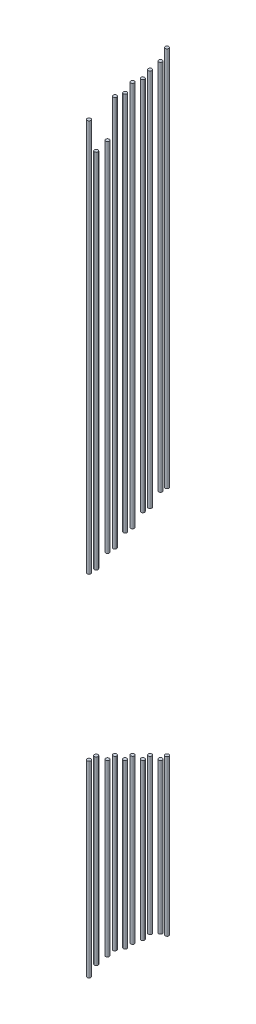
ISO-10303-21;
HEADER;
FILE_DESCRIPTION(('STEP AP214'),'2;1');
FILE_NAME('part.step','',(''),(''),'','','');
FILE_SCHEMA(('AUTOMOTIVE_DESIGN { 1 0 10303 214 1 1 1 1 }'));
ENDSEC;
DATA;
#1=APPLICATION_CONTEXT('core data for automotive mechanical design processes');
#2=APPLICATION_PROTOCOL_DEFINITION('international standard','automotive_design',2000,#1);
#3=PRODUCT_CONTEXT('',#1,'mechanical');
#4=PRODUCT('Part','Part','',(#3));
#5=PRODUCT_RELATED_PRODUCT_CATEGORY('part','',(#4));
#6=PRODUCT_DEFINITION_FORMATION('','',#4);
#7=PRODUCT_DEFINITION_CONTEXT('part definition',#1,'design');
#8=PRODUCT_DEFINITION('design','',#6,#7);
#9=PRODUCT_DEFINITION_SHAPE('','',#8);
#10=(LENGTH_UNIT() NAMED_UNIT(*) SI_UNIT(.MILLI.,.METRE.));
#11=(NAMED_UNIT(*) PLANE_ANGLE_UNIT() SI_UNIT($,.RADIAN.));
#12=(NAMED_UNIT(*) SI_UNIT($,.STERADIAN.) SOLID_ANGLE_UNIT());
#13=UNCERTAINTY_MEASURE_WITH_UNIT(LENGTH_MEASURE(1.E-05),#10,'distance_accuracy_value','');
#14=(GEOMETRIC_REPRESENTATION_CONTEXT(3) GLOBAL_UNCERTAINTY_ASSIGNED_CONTEXT((#13)) GLOBAL_UNIT_ASSIGNED_CONTEXT((#10,
#11,#12)) REPRESENTATION_CONTEXT('',''));
#15=CARTESIAN_POINT('',(0.,0.,0.));
#16=DIRECTION('',(0.,0.,1.));
#17=DIRECTION('',(1.,0.,0.));
#18=AXIS2_PLACEMENT_3D('',#15,#16,#17);
#19=CARTESIAN_POINT('',(0.,-39.622,54.4508943198857));
#20=DIRECTION('',(0.,-1.,0.));
#21=DIRECTION('',(1.,0.,0.));
#22=AXIS2_PLACEMENT_3D('',#19,#20,#21);
#23=PLANE('',#22);
#24=CARTESIAN_POINT('',(0.,-39.622,54.4508943198857));
#25=DIRECTION('',(0.,-1.,0.));
#26=DIRECTION('',(1.,0.,0.));
#27=AXIS2_PLACEMENT_3D('',#24,#25,#26);
#28=CIRCLE('',#27,0.79375);
#29=CARTESIAN_POINT('',(0.793749999999992,-39.622,54.4508943198857));
#30=VERTEX_POINT('',#29);
#31=EDGE_CURVE('P0_E24',#30,#30,#28,.T.);
#32=ORIENTED_EDGE('',*,*,#31,.F.);
#33=EDGE_LOOP('',(#32));
#34=FACE_BOUND('',#33,.T.);
#35=ADVANCED_FACE('P0_F17',(#34),#23,.F.);
#36=CARTESIAN_POINT('',(0.,-114.047221253725,54.4508943198857));
#37=DIRECTION('',(0.,-1.,0.));
#38=DIRECTION('',(1.,0.,0.));
#39=AXIS2_PLACEMENT_3D('',#36,#37,#38);
#40=PLANE('',#39);
#41=CARTESIAN_POINT('',(0.,-114.047221253725,54.4508943198857));
#42=DIRECTION('',(0.,-1.,0.));
#43=DIRECTION('',(1.,0.,0.));
#44=AXIS2_PLACEMENT_3D('',#41,#42,#43);
#45=CIRCLE('',#44,0.79375);
#46=CARTESIAN_POINT('',(0.793749999999988,-114.047221253725,54.4508943198857));
#47=VERTEX_POINT('',#46);
#48=EDGE_CURVE('P0_E11',#47,#47,#45,.T.);
#49=ORIENTED_EDGE('',*,*,#48,.T.);
#50=EDGE_LOOP('',(#49));
#51=FACE_BOUND('',#50,.T.);
#52=ADVANCED_FACE('P0_F31',(#51),#40,.T.);
#53=CARTESIAN_POINT('',(0.,-39.622,54.4508943198857));
#54=DIRECTION('',(0.,-1.,0.));
#55=DIRECTION('',(1.,0.,0.));
#56=AXIS2_PLACEMENT_3D('',#53,#54,#55);
#57=CYLINDRICAL_SURFACE('',#56,0.79375);
#58=ORIENTED_EDGE('',*,*,#48,.F.);
#59=EDGE_LOOP('',(#58));
#60=FACE_BOUND('',#59,.T.);
#61=ORIENTED_EDGE('',*,*,#31,.T.);
#62=EDGE_LOOP('',(#61));
#63=FACE_BOUND('',#62,.T.);
#64=ADVANCED_FACE('P0_F33',(#60,#63),#57,.T.);
#65=CLOSED_SHELL('',(#35,#52,#64));
#66=MANIFOLD_SOLID_BREP('P0_B1',#65);
#67=CARTESIAN_POINT('',(0.,35.741,65.8775251753315));
#68=DIRECTION('',(0.,1.,0.));
#69=DIRECTION('',(0.,0.,1.));
#70=AXIS2_PLACEMENT_3D('',#67,#68,#69);
#71=PLANE('',#70);
#72=CARTESIAN_POINT('',(0.,35.741,65.8775251753315));
#73=DIRECTION('',(0.,1.,0.));
#74=DIRECTION('',(0.,0.,1.));
#75=AXIS2_PLACEMENT_3D('',#72,#73,#74);
#76=CIRCLE('',#75,0.79375);
#77=CARTESIAN_POINT('',(0.,35.741,66.6712751753314));
#78=VERTEX_POINT('',#77);
#79=EDGE_CURVE('P1_E24',#78,#78,#76,.T.);
#80=ORIENTED_EDGE('',*,*,#79,.F.);
#81=EDGE_LOOP('',(#80));
#82=FACE_BOUND('',#81,.T.);
#83=ADVANCED_FACE('P1_F17',(#82),#71,.F.);
#84=CARTESIAN_POINT('',(0.,209.207726538585,65.8775251753315));
#85=DIRECTION('',(0.,1.,0.));
#86=DIRECTION('',(0.,0.,1.));
#87=AXIS2_PLACEMENT_3D('',#84,#85,#86);
#88=PLANE('',#87);
#89=CARTESIAN_POINT('',(0.,209.207726538585,65.8775251753315));
#90=DIRECTION('',(0.,1.,0.));
#91=DIRECTION('',(0.,0.,1.));
#92=AXIS2_PLACEMENT_3D('',#89,#90,#91);
#93=CIRCLE('',#92,0.79375);
#94=CARTESIAN_POINT('',(0.,209.207726538585,66.6712751753314));
#95=VERTEX_POINT('',#94);
#96=EDGE_CURVE('P1_E11',#95,#95,#93,.T.);
#97=ORIENTED_EDGE('',*,*,#96,.T.);
#98=EDGE_LOOP('',(#97));
#99=FACE_BOUND('',#98,.T.);
#100=ADVANCED_FACE('P1_F31',(#99),#88,.T.);
#101=CARTESIAN_POINT('',(0.,35.741,65.8775251753315));
#102=DIRECTION('',(0.,1.,0.));
#103=DIRECTION('',(0.,0.,1.));
#104=AXIS2_PLACEMENT_3D('',#101,#102,#103);
#105=CYLINDRICAL_SURFACE('',#104,0.79375);
#106=ORIENTED_EDGE('',*,*,#96,.F.);
#107=EDGE_LOOP('',(#106));
#108=FACE_BOUND('',#107,.T.);
#109=ORIENTED_EDGE('',*,*,#79,.T.);
#110=EDGE_LOOP('',(#109));
#111=FACE_BOUND('',#110,.T.);
#112=ADVANCED_FACE('P1_F33',(#108,#111),#105,.T.);
#113=CLOSED_SHELL('',(#83,#100,#112));
#114=MANIFOLD_SOLID_BREP('P1_B1',#113);
#115=CARTESIAN_POINT('',(0.,-39.622,57.7065531730926));
#116=DIRECTION('',(0.,-1.,0.));
#117=DIRECTION('',(1.,0.,0.));
#118=AXIS2_PLACEMENT_3D('',#115,#116,#117);
#119=PLANE('',#118);
#120=CARTESIAN_POINT('',(0.,-39.622,57.7065531730926));
#121=DIRECTION('',(0.,-1.,0.));
#122=DIRECTION('',(1.,0.,0.));
#123=AXIS2_PLACEMENT_3D('',#120,#121,#122);
#124=CIRCLE('',#123,0.79375);
#125=CARTESIAN_POINT('',(0.793749999999992,-39.622,57.7065531730926));
#126=VERTEX_POINT('',#125);
#127=EDGE_CURVE('P2_E24',#126,#126,#124,.T.);
#128=ORIENTED_EDGE('',*,*,#127,.F.);
#129=EDGE_LOOP('',(#128));
#130=FACE_BOUND('',#129,.T.);
#131=ADVANCED_FACE('P2_F17',(#130),#119,.F.);
#132=CARTESIAN_POINT('',(0.,-114.748937656706,57.7065531730926));
#133=DIRECTION('',(0.,-1.,0.));
#134=DIRECTION('',(1.,0.,0.));
#135=AXIS2_PLACEMENT_3D('',#132,#133,#134);
#136=PLANE('',#135);
#137=CARTESIAN_POINT('',(0.,-114.748937656706,57.7065531730926));
#138=DIRECTION('',(0.,-1.,0.));
#139=DIRECTION('',(1.,0.,0.));
#140=AXIS2_PLACEMENT_3D('',#137,#138,#139);
#141=CIRCLE('',#140,0.79375);
#142=CARTESIAN_POINT('',(0.793749999999988,-114.748937656706,57.7065531730926));
#143=VERTEX_POINT('',#142);
#144=EDGE_CURVE('P2_E11',#143,#143,#141,.T.);
#145=ORIENTED_EDGE('',*,*,#144,.T.);
#146=EDGE_LOOP('',(#145));
#147=FACE_BOUND('',#146,.T.);
#148=ADVANCED_FACE('P2_F31',(#147),#136,.T.);
#149=CARTESIAN_POINT('',(0.,-39.622,57.7065531730926));
#150=DIRECTION('',(0.,-1.,0.));
#151=DIRECTION('',(1.,0.,0.));
#152=AXIS2_PLACEMENT_3D('',#149,#150,#151);
#153=CYLINDRICAL_SURFACE('',#152,0.79375);
#154=ORIENTED_EDGE('',*,*,#144,.F.);
#155=EDGE_LOOP('',(#154));
#156=FACE_BOUND('',#155,.T.);
#157=ORIENTED_EDGE('',*,*,#127,.T.);
#158=EDGE_LOOP('',(#157));
#159=FACE_BOUND('',#158,.T.);
#160=ADVANCED_FACE('P2_F33',(#156,#159),#153,.T.);
#161=CLOSED_SHELL('',(#131,#148,#160));
#162=MANIFOLD_SOLID_BREP('P2_B1',#161);
#163=CARTESIAN_POINT('',(0.,-35.741,65.8775251753315));
#164=DIRECTION('',(0.,-1.,0.));
#165=DIRECTION('',(1.,0.,0.));
#166=AXIS2_PLACEMENT_3D('',#163,#164,#165);
#167=PLANE('',#166);
#168=CARTESIAN_POINT('',(0.,-35.741,65.8775251753315));
#169=DIRECTION('',(0.,-1.,0.));
#170=DIRECTION('',(1.,0.,0.));
#171=AXIS2_PLACEMENT_3D('',#168,#169,#170);
#172=CIRCLE('',#171,0.79375);
#173=CARTESIAN_POINT('',(0.793749999999991,-35.741,65.8775251753315));
#174=VERTEX_POINT('',#173);
#175=EDGE_CURVE('P3_E24',#174,#174,#172,.T.);
#176=ORIENTED_EDGE('',*,*,#175,.F.);
#177=EDGE_LOOP('',(#176));
#178=FACE_BOUND('',#177,.T.);
#179=ADVANCED_FACE('P3_F17',(#178),#167,.F.);
#180=CARTESIAN_POINT('',(0.,-118.68636303821,65.8775251753315));
#181=DIRECTION('',(0.,-1.,0.));
#182=DIRECTION('',(1.,0.,0.));
#183=AXIS2_PLACEMENT_3D('',#180,#181,#182);
#184=PLANE('',#183);
#185=CARTESIAN_POINT('',(0.,-118.68636303821,65.8775251753315));
#186=DIRECTION('',(0.,-1.,0.));
#187=DIRECTION('',(1.,0.,0.));
#188=AXIS2_PLACEMENT_3D('',#185,#186,#187);
#189=CIRCLE('',#188,0.79375);
#190=CARTESIAN_POINT('',(0.793749999999987,-118.68636303821,65.8775251753315));
#191=VERTEX_POINT('',#190);
#192=EDGE_CURVE('P3_E11',#191,#191,#189,.T.);
#193=ORIENTED_EDGE('',*,*,#192,.T.);
#194=EDGE_LOOP('',(#193));
#195=FACE_BOUND('',#194,.T.);
#196=ADVANCED_FACE('P3_F31',(#195),#184,.T.);
#197=CARTESIAN_POINT('',(0.,-35.741,65.8775251753315));
#198=DIRECTION('',(0.,-1.,0.));
#199=DIRECTION('',(1.,0.,0.));
#200=AXIS2_PLACEMENT_3D('',#197,#198,#199);
#201=CYLINDRICAL_SURFACE('',#200,0.79375);
#202=ORIENTED_EDGE('',*,*,#192,.F.);
#203=EDGE_LOOP('',(#202));
#204=FACE_BOUND('',#203,.T.);
#205=ORIENTED_EDGE('',*,*,#175,.T.);
#206=EDGE_LOOP('',(#205));
#207=FACE_BOUND('',#206,.T.);
#208=ADVANCED_FACE('P3_F33',(#204,#207),#201,.T.);
#209=CLOSED_SHELL('',(#179,#196,#208));
#210=MANIFOLD_SOLID_BREP('P3_B1',#209);
#211=CARTESIAN_POINT('',(0.,-35.741,62.6864606732299));
#212=DIRECTION('',(0.,-1.,0.));
#213=DIRECTION('',(1.,0.,0.));
#214=AXIS2_PLACEMENT_3D('',#211,#212,#213);
#215=PLANE('',#214);
#216=CARTESIAN_POINT('',(0.,-35.741,62.6864606732299));
#217=DIRECTION('',(0.,-1.,0.));
#218=DIRECTION('',(1.,0.,0.));
#219=AXIS2_PLACEMENT_3D('',#216,#217,#218);
#220=CIRCLE('',#219,0.79375);
#221=CARTESIAN_POINT('',(0.793749999999991,-35.741,62.6864606732299));
#222=VERTEX_POINT('',#221);
#223=EDGE_CURVE('P4_E24',#222,#222,#220,.T.);
#224=ORIENTED_EDGE('',*,*,#223,.F.);
#225=EDGE_LOOP('',(#224));
#226=FACE_BOUND('',#225,.T.);
#227=ADVANCED_FACE('P4_F17',(#226),#215,.F.);
#228=CARTESIAN_POINT('',(0.,-115.587465922164,62.6864606732299));
#229=DIRECTION('',(0.,-1.,0.));
#230=DIRECTION('',(1.,0.,0.));
#231=AXIS2_PLACEMENT_3D('',#228,#229,#230);
#232=PLANE('',#231);
#233=CARTESIAN_POINT('',(0.,-115.587465922164,62.6864606732299));
#234=DIRECTION('',(0.,-1.,0.));
#235=DIRECTION('',(1.,0.,0.));
#236=AXIS2_PLACEMENT_3D('',#233,#234,#235);
#237=CIRCLE('',#236,0.79375);
#238=CARTESIAN_POINT('',(0.793749999999987,-115.587465922164,62.6864606732299));
#239=VERTEX_POINT('',#238);
#240=EDGE_CURVE('P4_E11',#239,#239,#237,.T.);
#241=ORIENTED_EDGE('',*,*,#240,.T.);
#242=EDGE_LOOP('',(#241));
#243=FACE_BOUND('',#242,.T.);
#244=ADVANCED_FACE('P4_F31',(#243),#232,.T.);
#245=CARTESIAN_POINT('',(0.,-35.741,62.6864606732299));
#246=DIRECTION('',(0.,-1.,0.));
#247=DIRECTION('',(1.,0.,0.));
#248=AXIS2_PLACEMENT_3D('',#245,#246,#247);
#249=CYLINDRICAL_SURFACE('',#248,0.79375);
#250=ORIENTED_EDGE('',*,*,#240,.F.);
#251=EDGE_LOOP('',(#250));
#252=FACE_BOUND('',#251,.T.);
#253=ORIENTED_EDGE('',*,*,#223,.T.);
#254=EDGE_LOOP('',(#253));
#255=FACE_BOUND('',#254,.T.);
#256=ADVANCED_FACE('P4_F33',(#252,#255),#249,.T.);
#257=CLOSED_SHELL('',(#227,#244,#256));
#258=MANIFOLD_SOLID_BREP('P4_B1',#257);
#259=CARTESIAN_POINT('',(0.,51.265000336,31.4140285526348));
#260=DIRECTION('',(0.,1.,0.));
#261=DIRECTION('',(0.,0.,1.));
#262=AXIS2_PLACEMENT_3D('',#259,#260,#261);
#263=PLANE('',#262);
#264=CARTESIAN_POINT('',(0.,51.265000336,31.4140285526348));
#265=DIRECTION('',(0.,1.,0.));
#266=DIRECTION('',(0.,0.,1.));
#267=AXIS2_PLACEMENT_3D('',#264,#265,#266);
#268=CIRCLE('',#267,0.79375);
#269=CARTESIAN_POINT('',(0.,51.265000336,32.2077785526348));
#270=VERTEX_POINT('',#269);
#271=EDGE_CURVE('P5_E24',#270,#270,#268,.T.);
#272=ORIENTED_EDGE('',*,*,#271,.F.);
#273=EDGE_LOOP('',(#272));
#274=FACE_BOUND('',#273,.T.);
#275=ADVANCED_FACE('P5_F17',(#274),#263,.F.);
#276=CARTESIAN_POINT('',(0.,219.477207078169,31.4140285526348));
#277=DIRECTION('',(0.,1.,0.));
#278=DIRECTION('',(0.,0.,1.));
#279=AXIS2_PLACEMENT_3D('',#276,#277,#278);
#280=PLANE('',#279);
#281=CARTESIAN_POINT('',(0.,219.477207078169,31.4140285526348));
#282=DIRECTION('',(0.,1.,0.));
#283=DIRECTION('',(0.,0.,1.));
#284=AXIS2_PLACEMENT_3D('',#281,#282,#283);
#285=CIRCLE('',#284,0.79375);
#286=CARTESIAN_POINT('',(0.,219.477207078169,32.2077785526348));
#287=VERTEX_POINT('',#286);
#288=EDGE_CURVE('P5_E11',#287,#287,#285,.T.);
#289=ORIENTED_EDGE('',*,*,#288,.T.);
#290=EDGE_LOOP('',(#289));
#291=FACE_BOUND('',#290,.T.);
#292=ADVANCED_FACE('P5_F31',(#291),#280,.T.);
#293=CARTESIAN_POINT('',(0.,51.265000336,31.4140285526348));
#294=DIRECTION('',(0.,1.,0.));
#295=DIRECTION('',(0.,0.,1.));
#296=AXIS2_PLACEMENT_3D('',#293,#294,#295);
#297=CYLINDRICAL_SURFACE('',#296,0.79375);
#298=ORIENTED_EDGE('',*,*,#288,.F.);
#299=EDGE_LOOP('',(#298));
#300=FACE_BOUND('',#299,.T.);
#301=ORIENTED_EDGE('',*,*,#271,.T.);
#302=EDGE_LOOP('',(#301));
#303=FACE_BOUND('',#302,.T.);
#304=ADVANCED_FACE('P5_F33',(#300,#303),#297,.T.);
#305=CLOSED_SHELL('',(#275,#292,#304));
#306=MANIFOLD_SOLID_BREP('P5_B1',#305);
#307=CARTESIAN_POINT('',(0.,51.265000336,34.2859866045261));
#308=DIRECTION('',(0.,1.,0.));
#309=DIRECTION('',(0.,0.,1.));
#310=AXIS2_PLACEMENT_3D('',#307,#308,#309);
#311=PLANE('',#310);
#312=CARTESIAN_POINT('',(0.,51.265000336,34.2859866045261));
#313=DIRECTION('',(0.,1.,0.));
#314=DIRECTION('',(0.,0.,1.));
#315=AXIS2_PLACEMENT_3D('',#312,#313,#314);
#316=CIRCLE('',#315,0.79375);
#317=CARTESIAN_POINT('',(0.,51.265000336,35.0797366045261));
#318=VERTEX_POINT('',#317);
#319=EDGE_CURVE('P6_E24',#318,#318,#316,.T.);
#320=ORIENTED_EDGE('',*,*,#319,.F.);
#321=EDGE_LOOP('',(#320));
#322=FACE_BOUND('',#321,.T.);
#323=ADVANCED_FACE('P6_F17',(#322),#311,.F.);
#324=CARTESIAN_POINT('',(0.,215.748604179682,34.2859866045261));
#325=DIRECTION('',(0.,1.,0.));
#326=DIRECTION('',(0.,0.,1.));
#327=AXIS2_PLACEMENT_3D('',#324,#325,#326);
#328=PLANE('',#327);
#329=CARTESIAN_POINT('',(0.,215.748604179682,34.2859866045261));
#330=DIRECTION('',(0.,1.,0.));
#331=DIRECTION('',(0.,0.,1.));
#332=AXIS2_PLACEMENT_3D('',#329,#330,#331);
#333=CIRCLE('',#332,0.79375);
#334=CARTESIAN_POINT('',(0.,215.748604179682,35.0797366045261));
#335=VERTEX_POINT('',#334);
#336=EDGE_CURVE('P6_E11',#335,#335,#333,.T.);
#337=ORIENTED_EDGE('',*,*,#336,.T.);
#338=EDGE_LOOP('',(#337));
#339=FACE_BOUND('',#338,.T.);
#340=ADVANCED_FACE('P6_F31',(#339),#328,.T.);
#341=CARTESIAN_POINT('',(0.,51.265000336,34.2859866045261));
#342=DIRECTION('',(0.,1.,0.));
#343=DIRECTION('',(0.,0.,1.));
#344=AXIS2_PLACEMENT_3D('',#341,#342,#343);
#345=CYLINDRICAL_SURFACE('',#344,0.79375);
#346=ORIENTED_EDGE('',*,*,#336,.F.);
#347=EDGE_LOOP('',(#346));
#348=FACE_BOUND('',#347,.T.);
#349=ORIENTED_EDGE('',*,*,#319,.T.);
#350=EDGE_LOOP('',(#349));
#351=FACE_BOUND('',#350,.T.);
#352=ADVANCED_FACE('P6_F33',(#348,#351),#345,.T.);
#353=CLOSED_SHELL('',(#323,#340,#352));
#354=MANIFOLD_SOLID_BREP('P6_B1',#353);
#355=CARTESIAN_POINT('',(0.,47.384000224,38.9130301325734));
#356=DIRECTION('',(0.,1.,0.));
#357=DIRECTION('',(0.,0.,1.));
#358=AXIS2_PLACEMENT_3D('',#355,#356,#357);
#359=PLANE('',#358);
#360=CARTESIAN_POINT('',(0.,47.384000224,38.9130301325734));
#361=DIRECTION('',(0.,1.,0.));
#362=DIRECTION('',(0.,0.,1.));
#363=AXIS2_PLACEMENT_3D('',#360,#361,#362);
#364=CIRCLE('',#363,0.79375);
#365=CARTESIAN_POINT('',(0.,47.384000224,39.7067801325734));
#366=VERTEX_POINT('',#365);
#367=EDGE_CURVE('P7_E24',#366,#366,#364,.T.);
#368=ORIENTED_EDGE('',*,*,#367,.F.);
#369=EDGE_LOOP('',(#368));
#370=FACE_BOUND('',#369,.T.);
#371=ADVANCED_FACE('P7_F17',(#370),#359,.F.);
#372=CARTESIAN_POINT('',(0.,214.791146898738,38.9130301325734));
#373=DIRECTION('',(0.,1.,0.));
#374=DIRECTION('',(0.,0.,1.));
#375=AXIS2_PLACEMENT_3D('',#372,#373,#374);
#376=PLANE('',#375);
#377=CARTESIAN_POINT('',(0.,214.791146898738,38.9130301325734));
#378=DIRECTION('',(0.,1.,0.));
#379=DIRECTION('',(0.,0.,1.));
#380=AXIS2_PLACEMENT_3D('',#377,#378,#379);
#381=CIRCLE('',#380,0.79375);
#382=CARTESIAN_POINT('',(0.,214.791146898738,39.7067801325734));
#383=VERTEX_POINT('',#382);
#384=EDGE_CURVE('P7_E11',#383,#383,#381,.T.);
#385=ORIENTED_EDGE('',*,*,#384,.T.);
#386=EDGE_LOOP('',(#385));
#387=FACE_BOUND('',#386,.T.);
#388=ADVANCED_FACE('P7_F31',(#387),#376,.T.);
#389=CARTESIAN_POINT('',(0.,47.384000224,38.9130301325734));
#390=DIRECTION('',(0.,1.,0.));
#391=DIRECTION('',(0.,0.,1.));
#392=AXIS2_PLACEMENT_3D('',#389,#390,#391);
#393=CYLINDRICAL_SURFACE('',#392,0.79375);
#394=ORIENTED_EDGE('',*,*,#384,.F.);
#395=EDGE_LOOP('',(#394));
#396=FACE_BOUND('',#395,.T.);
#397=ORIENTED_EDGE('',*,*,#367,.T.);
#398=EDGE_LOOP('',(#397));
#399=FACE_BOUND('',#398,.T.);
#400=ADVANCED_FACE('P7_F33',(#396,#399),#393,.T.);
#401=CLOSED_SHELL('',(#371,#388,#400));
#402=MANIFOLD_SOLID_BREP('P7_B1',#401);
#403=CARTESIAN_POINT('',(0.,47.384000224,42.1040946346749));
#404=DIRECTION('',(0.,1.,0.));
#405=DIRECTION('',(0.,0.,1.));
#406=AXIS2_PLACEMENT_3D('',#403,#404,#405);
#407=PLANE('',#406);
#408=CARTESIAN_POINT('',(0.,47.384000224,42.1040946346749));
#409=DIRECTION('',(0.,1.,0.));
#410=DIRECTION('',(0.,0.,1.));
#411=AXIS2_PLACEMENT_3D('',#408,#409,#410);
#412=CIRCLE('',#411,0.79375);
#413=CARTESIAN_POINT('',(0.,47.384000224,42.8978446346749));
#414=VERTEX_POINT('',#413);
#415=EDGE_CURVE('P8_E24',#414,#414,#412,.T.);
#416=ORIENTED_EDGE('',*,*,#415,.F.);
#417=EDGE_LOOP('',(#416));
#418=FACE_BOUND('',#417,.T.);
#419=ADVANCED_FACE('P8_F17',(#418),#407,.F.);
#420=CARTESIAN_POINT('',(0.,213.06281440902,42.1040946346749));
#421=DIRECTION('',(0.,1.,0.));
#422=DIRECTION('',(0.,0.,1.));
#423=AXIS2_PLACEMENT_3D('',#420,#421,#422);
#424=PLANE('',#423);
#425=CARTESIAN_POINT('',(0.,213.06281440902,42.1040946346749));
#426=DIRECTION('',(0.,1.,0.));
#427=DIRECTION('',(0.,0.,1.));
#428=AXIS2_PLACEMENT_3D('',#425,#426,#427);
#429=CIRCLE('',#428,0.79375);
#430=CARTESIAN_POINT('',(0.,213.06281440902,42.8978446346749));
#431=VERTEX_POINT('',#430);
#432=EDGE_CURVE('P8_E11',#431,#431,#429,.T.);
#433=ORIENTED_EDGE('',*,*,#432,.T.);
#434=EDGE_LOOP('',(#433));
#435=FACE_BOUND('',#434,.T.);
#436=ADVANCED_FACE('P8_F31',(#435),#424,.T.);
#437=CARTESIAN_POINT('',(0.,47.384000224,42.1040946346749));
#438=DIRECTION('',(0.,1.,0.));
#439=DIRECTION('',(0.,0.,1.));
#440=AXIS2_PLACEMENT_3D('',#437,#438,#439);
#441=CYLINDRICAL_SURFACE('',#440,0.79375);
#442=ORIENTED_EDGE('',*,*,#432,.F.);
#443=EDGE_LOOP('',(#442));
#444=FACE_BOUND('',#443,.T.);
#445=ORIENTED_EDGE('',*,*,#415,.T.);
#446=EDGE_LOOP('',(#445));
#447=FACE_BOUND('',#446,.T.);
#448=ADVANCED_FACE('P8_F33',(#444,#447),#441,.T.);
#449=CLOSED_SHELL('',(#419,#436,#448));
#450=MANIFOLD_SOLID_BREP('P8_B1',#449);
#451=CARTESIAN_POINT('',(0.,43.503000112,46.6373130721891));
#452=DIRECTION('',(0.,1.,0.));
#453=DIRECTION('',(0.,0.,1.));
#454=AXIS2_PLACEMENT_3D('',#451,#452,#453);
#455=PLANE('',#454);
#456=CARTESIAN_POINT('',(0.,43.503000112,46.6373130721891));
#457=DIRECTION('',(0.,1.,0.));
#458=DIRECTION('',(0.,0.,1.));
#459=AXIS2_PLACEMENT_3D('',#456,#457,#458);
#460=CIRCLE('',#459,0.79375);
#461=CARTESIAN_POINT('',(0.,43.503000112,47.4310630721891));
#462=VERTEX_POINT('',#461);
#463=EDGE_CURVE('P9_E24',#462,#462,#460,.T.);
#464=ORIENTED_EDGE('',*,*,#463,.F.);
#465=EDGE_LOOP('',(#464));
#466=FACE_BOUND('',#465,.T.);
#467=ADVANCED_FACE('P9_F17',(#466),#455,.F.);
#468=CARTESIAN_POINT('',(0.,213.899559557136,46.6373130721891));
#469=DIRECTION('',(0.,1.,0.));
#470=DIRECTION('',(0.,0.,1.));
#471=AXIS2_PLACEMENT_3D('',#468,#469,#470);
#472=PLANE('',#471);
#473=CARTESIAN_POINT('',(0.,213.899559557136,46.6373130721891));
#474=DIRECTION('',(0.,1.,0.));
#475=DIRECTION('',(0.,0.,1.));
#476=AXIS2_PLACEMENT_3D('',#473,#474,#475);
#477=CIRCLE('',#476,0.79375);
#478=CARTESIAN_POINT('',(0.,213.899559557136,47.4310630721891));
#479=VERTEX_POINT('',#478);
#480=EDGE_CURVE('P9_E11',#479,#479,#477,.T.);
#481=ORIENTED_EDGE('',*,*,#480,.T.);
#482=EDGE_LOOP('',(#481));
#483=FACE_BOUND('',#482,.T.);
#484=ADVANCED_FACE('P9_F31',(#483),#472,.T.);
#485=CARTESIAN_POINT('',(0.,43.503000112,46.6373130721891));
#486=DIRECTION('',(0.,1.,0.));
#487=DIRECTION('',(0.,0.,1.));
#488=AXIS2_PLACEMENT_3D('',#485,#486,#487);
#489=CYLINDRICAL_SURFACE('',#488,0.79375);
#490=ORIENTED_EDGE('',*,*,#480,.F.);
#491=EDGE_LOOP('',(#490));
#492=FACE_BOUND('',#491,.T.);
#493=ORIENTED_EDGE('',*,*,#463,.T.);
#494=EDGE_LOOP('',(#493));
#495=FACE_BOUND('',#494,.T.);
#496=ADVANCED_FACE('P9_F33',(#492,#495),#489,.T.);
#497=CLOSED_SHELL('',(#467,#484,#496));
#498=MANIFOLD_SOLID_BREP('P9_B1',#497);
#499=CARTESIAN_POINT('',(0.,43.503000112,49.892971925396));
#500=DIRECTION('',(0.,1.,0.));
#501=DIRECTION('',(0.,0.,1.));
#502=AXIS2_PLACEMENT_3D('',#499,#500,#501);
#503=PLANE('',#502);
#504=CARTESIAN_POINT('',(0.,43.503000112,49.892971925396));
#505=DIRECTION('',(0.,1.,0.));
#506=DIRECTION('',(0.,0.,1.));
#507=AXIS2_PLACEMENT_3D('',#504,#505,#506);
#508=CIRCLE('',#507,0.79375);
#509=CARTESIAN_POINT('',(0.,43.503000112,50.686721925396));
#510=VERTEX_POINT('',#509);
#511=EDGE_CURVE('P10_E24',#510,#510,#508,.T.);
#512=ORIENTED_EDGE('',*,*,#511,.F.);
#513=EDGE_LOOP('',(#512));
#514=FACE_BOUND('',#513,.T.);
#515=ADVANCED_FACE('P10_F17',(#514),#503,.F.);
#516=CARTESIAN_POINT('',(0.,211.401303544861,49.892971925396));
#517=DIRECTION('',(0.,1.,0.));
#518=DIRECTION('',(0.,0.,1.));
#519=AXIS2_PLACEMENT_3D('',#516,#517,#518);
#520=PLANE('',#519);
#521=CARTESIAN_POINT('',(0.,211.401303544861,49.892971925396));
#522=DIRECTION('',(0.,1.,0.));
#523=DIRECTION('',(0.,0.,1.));
#524=AXIS2_PLACEMENT_3D('',#521,#522,#523);
#525=CIRCLE('',#524,0.79375);
#526=CARTESIAN_POINT('',(0.,211.401303544861,50.686721925396));
#527=VERTEX_POINT('',#526);
#528=EDGE_CURVE('P10_E11',#527,#527,#525,.T.);
#529=ORIENTED_EDGE('',*,*,#528,.T.);
#530=EDGE_LOOP('',(#529));
#531=FACE_BOUND('',#530,.T.);
#532=ADVANCED_FACE('P10_F31',(#531),#520,.T.);
#533=CARTESIAN_POINT('',(0.,43.503000112,49.892971925396));
#534=DIRECTION('',(0.,1.,0.));
#535=DIRECTION('',(0.,0.,1.));
#536=AXIS2_PLACEMENT_3D('',#533,#534,#535);
#537=CYLINDRICAL_SURFACE('',#536,0.79375);
#538=ORIENTED_EDGE('',*,*,#528,.F.);
#539=EDGE_LOOP('',(#538));
#540=FACE_BOUND('',#539,.T.);
#541=ORIENTED_EDGE('',*,*,#511,.T.);
#542=EDGE_LOOP('',(#541));
#543=FACE_BOUND('',#542,.T.);
#544=ADVANCED_FACE('P10_F33',(#540,#543),#537,.T.);
#545=CLOSED_SHELL('',(#515,#532,#544));
#546=MANIFOLD_SOLID_BREP('P10_B1',#545);
#547=CARTESIAN_POINT('',(0.,39.622,54.4508943198857));
#548=DIRECTION('',(0.,1.,0.));
#549=DIRECTION('',(0.,0.,1.));
#550=AXIS2_PLACEMENT_3D('',#547,#548,#549);
#551=PLANE('',#550);
#552=CARTESIAN_POINT('',(0.,39.622,54.4508943198857));
#553=DIRECTION('',(0.,1.,0.));
#554=DIRECTION('',(0.,0.,1.));
#555=AXIS2_PLACEMENT_3D('',#552,#553,#554);
#556=CIRCLE('',#555,0.79375);
#557=CARTESIAN_POINT('',(0.,39.622,55.2446443198857));
#558=VERTEX_POINT('',#557);
#559=EDGE_CURVE('P11_E24',#558,#558,#556,.T.);
#560=ORIENTED_EDGE('',*,*,#559,.F.);
#561=EDGE_LOOP('',(#560));
#562=FACE_BOUND('',#561,.T.);
#563=ADVANCED_FACE('P11_F17',(#562),#551,.F.);
#564=CARTESIAN_POINT('',(0.,212.398221631266,54.4508943198857));
#565=DIRECTION('',(0.,1.,0.));
#566=DIRECTION('',(0.,0.,1.));
#567=AXIS2_PLACEMENT_3D('',#564,#565,#566);
#568=PLANE('',#567);
#569=CARTESIAN_POINT('',(0.,212.398221631266,54.4508943198857));
#570=DIRECTION('',(0.,1.,0.));
#571=DIRECTION('',(0.,0.,1.));
#572=AXIS2_PLACEMENT_3D('',#569,#570,#571);
#573=CIRCLE('',#572,0.79375);
#574=CARTESIAN_POINT('',(0.,212.398221631266,55.2446443198857));
#575=VERTEX_POINT('',#574);
#576=EDGE_CURVE('P11_E11',#575,#575,#573,.T.);
#577=ORIENTED_EDGE('',*,*,#576,.T.);
#578=EDGE_LOOP('',(#577));
#579=FACE_BOUND('',#578,.T.);
#580=ADVANCED_FACE('P11_F31',(#579),#568,.T.);
#581=CARTESIAN_POINT('',(0.,39.622,54.4508943198857));
#582=DIRECTION('',(0.,1.,0.));
#583=DIRECTION('',(0.,0.,1.));
#584=AXIS2_PLACEMENT_3D('',#581,#582,#583);
#585=CYLINDRICAL_SURFACE('',#584,0.79375);
#586=ORIENTED_EDGE('',*,*,#576,.F.);
#587=EDGE_LOOP('',(#586));
#588=FACE_BOUND('',#587,.T.);
#589=ORIENTED_EDGE('',*,*,#559,.T.);
#590=EDGE_LOOP('',(#589));
#591=FACE_BOUND('',#590,.T.);
#592=ADVANCED_FACE('P11_F33',(#588,#591),#585,.T.);
#593=CLOSED_SHELL('',(#563,#580,#592));
#594=MANIFOLD_SOLID_BREP('P11_B1',#593);
#595=CARTESIAN_POINT('',(0.,39.622,57.7065531730926));
#596=DIRECTION('',(0.,1.,0.));
#597=DIRECTION('',(0.,0.,1.));
#598=AXIS2_PLACEMENT_3D('',#595,#596,#597);
#599=PLANE('',#598);
#600=CARTESIAN_POINT('',(0.,39.622,57.7065531730926));
#601=DIRECTION('',(0.,1.,0.));
#602=DIRECTION('',(0.,0.,1.));
#603=AXIS2_PLACEMENT_3D('',#600,#601,#602);
#604=CIRCLE('',#603,0.79375);
#605=CARTESIAN_POINT('',(0.,39.622,58.5003031730926));
#606=VERTEX_POINT('',#605);
#607=EDGE_CURVE('P12_E24',#606,#606,#604,.T.);
#608=ORIENTED_EDGE('',*,*,#607,.F.);
#609=EDGE_LOOP('',(#608));
#610=FACE_BOUND('',#609,.T.);
#611=ADVANCED_FACE('P12_F17',(#610),#599,.F.);
#612=CARTESIAN_POINT('',(0.,197.162198407502,57.7065531730926));
#613=DIRECTION('',(0.,1.,0.));
#614=DIRECTION('',(0.,0.,1.));
#615=AXIS2_PLACEMENT_3D('',#612,#613,#614);
#616=PLANE('',#615);
#617=CARTESIAN_POINT('',(0.,197.162198407502,57.7065531730926));
#618=DIRECTION('',(0.,1.,0.));
#619=DIRECTION('',(0.,0.,1.));
#620=AXIS2_PLACEMENT_3D('',#617,#618,#619);
#621=CIRCLE('',#620,0.79375);
#622=CARTESIAN_POINT('',(0.,197.162198407502,58.5003031730926));
#623=VERTEX_POINT('',#622);
#624=EDGE_CURVE('P12_E11',#623,#623,#621,.T.);
#625=ORIENTED_EDGE('',*,*,#624,.T.);
#626=EDGE_LOOP('',(#625));
#627=FACE_BOUND('',#626,.T.);
#628=ADVANCED_FACE('P12_F31',(#627),#616,.T.);
#629=CARTESIAN_POINT('',(0.,39.622,57.7065531730926));
#630=DIRECTION('',(0.,1.,0.));
#631=DIRECTION('',(0.,0.,1.));
#632=AXIS2_PLACEMENT_3D('',#629,#630,#631);
#633=CYLINDRICAL_SURFACE('',#632,0.79375);
#634=ORIENTED_EDGE('',*,*,#624,.F.);
#635=EDGE_LOOP('',(#634));
#636=FACE_BOUND('',#635,.T.);
#637=ORIENTED_EDGE('',*,*,#607,.T.);
#638=EDGE_LOOP('',(#637));
#639=FACE_BOUND('',#638,.T.);
#640=ADVANCED_FACE('P12_F33',(#636,#639),#633,.T.);
#641=CLOSED_SHELL('',(#611,#628,#640));
#642=MANIFOLD_SOLID_BREP('P12_B1',#641);
#643=CARTESIAN_POINT('',(0.,35.741,62.6864606732299));
#644=DIRECTION('',(0.,1.,0.));
#645=DIRECTION('',(0.,0.,1.));
#646=AXIS2_PLACEMENT_3D('',#643,#644,#645);
#647=PLANE('',#646);
#648=CARTESIAN_POINT('',(0.,35.741,62.6864606732299));
#649=DIRECTION('',(0.,1.,0.));
#650=DIRECTION('',(0.,0.,1.));
#651=AXIS2_PLACEMENT_3D('',#648,#649,#650);
#652=CIRCLE('',#651,0.79375);
#653=CARTESIAN_POINT('',(0.,35.741,63.4802106732299));
#654=VERTEX_POINT('',#653);
#655=EDGE_CURVE('P13_E24',#654,#654,#652,.T.);
#656=ORIENTED_EDGE('',*,*,#655,.F.);
#657=EDGE_LOOP('',(#656));
#658=FACE_BOUND('',#657,.T.);
#659=ADVANCED_FACE('P13_F17',(#658),#647,.F.);
#660=CARTESIAN_POINT('',(0.,195.587617175562,62.6864606732299));
#661=DIRECTION('',(0.,1.,0.));
#662=DIRECTION('',(0.,0.,1.));
#663=AXIS2_PLACEMENT_3D('',#660,#661,#662);
#664=PLANE('',#663);
#665=CARTESIAN_POINT('',(0.,195.587617175562,62.6864606732299));
#666=DIRECTION('',(0.,1.,0.));
#667=DIRECTION('',(0.,0.,1.));
#668=AXIS2_PLACEMENT_3D('',#665,#666,#667);
#669=CIRCLE('',#668,0.79375);
#670=CARTESIAN_POINT('',(0.,195.587617175562,63.4802106732299));
#671=VERTEX_POINT('',#670);
#672=EDGE_CURVE('P13_E11',#671,#671,#669,.T.);
#673=ORIENTED_EDGE('',*,*,#672,.T.);
#674=EDGE_LOOP('',(#673));
#675=FACE_BOUND('',#674,.T.);
#676=ADVANCED_FACE('P13_F31',(#675),#664,.T.);
#677=CARTESIAN_POINT('',(0.,35.741,62.6864606732299));
#678=DIRECTION('',(0.,1.,0.));
#679=DIRECTION('',(0.,0.,1.));
#680=AXIS2_PLACEMENT_3D('',#677,#678,#679);
#681=CYLINDRICAL_SURFACE('',#680,0.79375);
#682=ORIENTED_EDGE('',*,*,#672,.F.);
#683=EDGE_LOOP('',(#682));
#684=FACE_BOUND('',#683,.T.);
#685=ORIENTED_EDGE('',*,*,#655,.T.);
#686=EDGE_LOOP('',(#685));
#687=FACE_BOUND('',#686,.T.);
#688=ADVANCED_FACE('P13_F33',(#684,#687),#681,.T.);
#689=CLOSED_SHELL('',(#659,#676,#688));
#690=MANIFOLD_SOLID_BREP('P13_B1',#689);
#691=CARTESIAN_POINT('',(0.,-51.265000336,31.4140285526348));
#692=DIRECTION('',(0.,-1.,0.));
#693=DIRECTION('',(1.,0.,0.));
#694=AXIS2_PLACEMENT_3D('',#691,#692,#693);
#695=PLANE('',#694);
#696=CARTESIAN_POINT('',(0.,-51.265000336,31.4140285526348));
#697=DIRECTION('',(0.,-1.,0.));
#698=DIRECTION('',(1.,0.,0.));
#699=AXIS2_PLACEMENT_3D('',#696,#697,#698);
#700=CIRCLE('',#699,0.79375);
#701=CARTESIAN_POINT('',(0.793749999999994,-51.265000336,31.4140285526348));
#702=VERTEX_POINT('',#701);
#703=EDGE_CURVE('P14_E24',#702,#702,#700,.T.);
#704=ORIENTED_EDGE('',*,*,#703,.F.);
#705=EDGE_LOOP('',(#704));
#706=FACE_BOUND('',#705,.T.);
#707=ADVANCED_FACE('P14_F17',(#706),#695,.F.);
#708=CARTESIAN_POINT('',(0.,-119.973150376708,31.4140285526348));
#709=DIRECTION('',(0.,-1.,0.));
#710=DIRECTION('',(1.,0.,0.));
#711=AXIS2_PLACEMENT_3D('',#708,#709,#710);
#712=PLANE('',#711);
#713=CARTESIAN_POINT('',(0.,-119.973150376708,31.4140285526348));
#714=DIRECTION('',(0.,-1.,0.));
#715=DIRECTION('',(1.,0.,0.));
#716=AXIS2_PLACEMENT_3D('',#713,#714,#715);
#717=CIRCLE('',#716,0.79375);
#718=CARTESIAN_POINT('',(0.79374999999999,-119.973150376708,31.4140285526348));
#719=VERTEX_POINT('',#718);
#720=EDGE_CURVE('P14_E11',#719,#719,#717,.T.);
#721=ORIENTED_EDGE('',*,*,#720,.T.);
#722=EDGE_LOOP('',(#721));
#723=FACE_BOUND('',#722,.T.);
#724=ADVANCED_FACE('P14_F31',(#723),#712,.T.);
#725=CARTESIAN_POINT('',(0.,-51.265000336,31.4140285526348));
#726=DIRECTION('',(0.,-1.,0.));
#727=DIRECTION('',(1.,0.,0.));
#728=AXIS2_PLACEMENT_3D('',#725,#726,#727);
#729=CYLINDRICAL_SURFACE('',#728,0.79375);
#730=ORIENTED_EDGE('',*,*,#720,.F.);
#731=EDGE_LOOP('',(#730));
#732=FACE_BOUND('',#731,.T.);
#733=ORIENTED_EDGE('',*,*,#703,.T.);
#734=EDGE_LOOP('',(#733));
#735=FACE_BOUND('',#734,.T.);
#736=ADVANCED_FACE('P14_F33',(#732,#735),#729,.T.);
#737=CLOSED_SHELL('',(#707,#724,#736));
#738=MANIFOLD_SOLID_BREP('P14_B1',#737);
#739=CARTESIAN_POINT('',(0.,-51.265000336,34.2859866045262));
#740=DIRECTION('',(0.,-1.,0.));
#741=DIRECTION('',(1.,0.,0.));
#742=AXIS2_PLACEMENT_3D('',#739,#740,#741);
#743=PLANE('',#742);
#744=CARTESIAN_POINT('',(0.,-51.265000336,34.2859866045262));
#745=DIRECTION('',(0.,-1.,0.));
#746=DIRECTION('',(1.,0.,0.));
#747=AXIS2_PLACEMENT_3D('',#744,#745,#746);
#748=CIRCLE('',#747,0.79375);
#749=CARTESIAN_POINT('',(0.793749999999994,-51.265000336,34.2859866045262));
#750=VERTEX_POINT('',#749);
#751=EDGE_CURVE('P15_E24',#750,#750,#748,.T.);
#752=ORIENTED_EDGE('',*,*,#751,.F.);
#753=EDGE_LOOP('',(#752));
#754=FACE_BOUND('',#753,.T.);
#755=ADVANCED_FACE('P15_F17',(#754),#743,.F.);
#756=CARTESIAN_POINT('',(0.,-117.743340356067,34.2859866045262));
#757=DIRECTION('',(0.,-1.,0.));
#758=DIRECTION('',(1.,0.,0.));
#759=AXIS2_PLACEMENT_3D('',#756,#757,#758);
#760=PLANE('',#759);
#761=CARTESIAN_POINT('',(0.,-117.743340356067,34.2859866045262));
#762=DIRECTION('',(0.,-1.,0.));
#763=DIRECTION('',(1.,0.,0.));
#764=AXIS2_PLACEMENT_3D('',#761,#762,#763);
#765=CIRCLE('',#764,0.79375);
#766=CARTESIAN_POINT('',(0.79374999999999,-117.743340356067,34.2859866045262));
#767=VERTEX_POINT('',#766);
#768=EDGE_CURVE('P15_E11',#767,#767,#765,.T.);
#769=ORIENTED_EDGE('',*,*,#768,.T.);
#770=EDGE_LOOP('',(#769));
#771=FACE_BOUND('',#770,.T.);
#772=ADVANCED_FACE('P15_F31',(#771),#760,.T.);
#773=CARTESIAN_POINT('',(0.,-51.265000336,34.2859866045262));
#774=DIRECTION('',(0.,-1.,0.));
#775=DIRECTION('',(1.,0.,0.));
#776=AXIS2_PLACEMENT_3D('',#773,#774,#775);
#777=CYLINDRICAL_SURFACE('',#776,0.79375);
#778=ORIENTED_EDGE('',*,*,#768,.F.);
#779=EDGE_LOOP('',(#778));
#780=FACE_BOUND('',#779,.T.);
#781=ORIENTED_EDGE('',*,*,#751,.T.);
#782=EDGE_LOOP('',(#781));
#783=FACE_BOUND('',#782,.T.);
#784=ADVANCED_FACE('P15_F33',(#780,#783),#777,.T.);
#785=CLOSED_SHELL('',(#755,#772,#784));
#786=MANIFOLD_SOLID_BREP('P15_B1',#785);
#787=CARTESIAN_POINT('',(0.,-47.384000224,38.9130301325734));
#788=DIRECTION('',(0.,-1.,0.));
#789=DIRECTION('',(1.,0.,0.));
#790=AXIS2_PLACEMENT_3D('',#787,#788,#789);
#791=PLANE('',#790);
#792=CARTESIAN_POINT('',(0.,-47.384000224,38.9130301325734));
#793=DIRECTION('',(0.,-1.,0.));
#794=DIRECTION('',(1.,0.,0.));
#795=AXIS2_PLACEMENT_3D('',#792,#793,#794);
#796=CIRCLE('',#795,0.79375);
#797=CARTESIAN_POINT('',(0.793749999999993,-47.384000224,38.9130301325734));
#798=VERTEX_POINT('',#797);
#799=EDGE_CURVE('P16_E24',#798,#798,#796,.T.);
#800=ORIENTED_EDGE('',*,*,#799,.F.);
#801=EDGE_LOOP('',(#800));
#802=FACE_BOUND('',#801,.T.);
#803=ADVANCED_FACE('P16_F17',(#802),#791,.F.);
#804=CARTESIAN_POINT('',(0.,-115.590719148495,38.9130301325734));
#805=DIRECTION('',(0.,-1.,0.));
#806=DIRECTION('',(1.,0.,0.));
#807=AXIS2_PLACEMENT_3D('',#804,#805,#806);
#808=PLANE('',#807);
#809=CARTESIAN_POINT('',(0.,-115.590719148495,38.9130301325734));
#810=DIRECTION('',(0.,-1.,0.));
#811=DIRECTION('',(1.,0.,0.));
#812=AXIS2_PLACEMENT_3D('',#809,#810,#811);
#813=CIRCLE('',#812,0.79375);
#814=CARTESIAN_POINT('',(0.79374999999999,-115.590719148495,38.9130301325734));
#815=VERTEX_POINT('',#814);
#816=EDGE_CURVE('P16_E11',#815,#815,#813,.T.);
#817=ORIENTED_EDGE('',*,*,#816,.T.);
#818=EDGE_LOOP('',(#817));
#819=FACE_BOUND('',#818,.T.);
#820=ADVANCED_FACE('P16_F31',(#819),#808,.T.);
#821=CARTESIAN_POINT('',(0.,-47.384000224,38.9130301325734));
#822=DIRECTION('',(0.,-1.,0.));
#823=DIRECTION('',(1.,0.,0.));
#824=AXIS2_PLACEMENT_3D('',#821,#822,#823);
#825=CYLINDRICAL_SURFACE('',#824,0.79375);
#826=ORIENTED_EDGE('',*,*,#816,.F.);
#827=EDGE_LOOP('',(#826));
#828=FACE_BOUND('',#827,.T.);
#829=ORIENTED_EDGE('',*,*,#799,.T.);
#830=EDGE_LOOP('',(#829));
#831=FACE_BOUND('',#830,.T.);
#832=ADVANCED_FACE('P16_F33',(#828,#831),#825,.T.);
#833=CLOSED_SHELL('',(#803,#820,#832));
#834=MANIFOLD_SOLID_BREP('P16_B1',#833);
#835=CARTESIAN_POINT('',(0.,-47.384000224,42.1040946346749));
#836=DIRECTION('',(0.,-1.,0.));
#837=DIRECTION('',(1.,0.,0.));
#838=AXIS2_PLACEMENT_3D('',#835,#836,#837);
#839=PLANE('',#838);
#840=CARTESIAN_POINT('',(0.,-47.384000224,42.1040946346749));
#841=DIRECTION('',(0.,-1.,0.));
#842=DIRECTION('',(1.,0.,0.));
#843=AXIS2_PLACEMENT_3D('',#840,#841,#842);
#844=CIRCLE('',#843,0.79375);
#845=CARTESIAN_POINT('',(0.793749999999993,-47.384000224,42.1040946346749));
#846=VERTEX_POINT('',#845);
#847=EDGE_CURVE('P17_E24',#846,#846,#844,.T.);
#848=ORIENTED_EDGE('',*,*,#847,.F.);
#849=EDGE_LOOP('',(#848));
#850=FACE_BOUND('',#849,.T.);
#851=ADVANCED_FACE('P17_F17',(#850),#839,.F.);
#852=CARTESIAN_POINT('',(0.,-116.261297597274,42.1040946346749));
#853=DIRECTION('',(0.,-1.,0.));
#854=DIRECTION('',(1.,0.,0.));
#855=AXIS2_PLACEMENT_3D('',#852,#853,#854);
#856=PLANE('',#855);
#857=CARTESIAN_POINT('',(0.,-116.261297597274,42.1040946346749));
#858=DIRECTION('',(0.,-1.,0.));
#859=DIRECTION('',(1.,0.,0.));
#860=AXIS2_PLACEMENT_3D('',#857,#858,#859);
#861=CIRCLE('',#860,0.79375);
#862=CARTESIAN_POINT('',(0.793749999999989,-116.261297597274,42.1040946346749));
#863=VERTEX_POINT('',#862);
#864=EDGE_CURVE('P17_E11',#863,#863,#861,.T.);
#865=ORIENTED_EDGE('',*,*,#864,.T.);
#866=EDGE_LOOP('',(#865));
#867=FACE_BOUND('',#866,.T.);
#868=ADVANCED_FACE('P17_F31',(#867),#856,.T.);
#869=CARTESIAN_POINT('',(0.,-47.384000224,42.1040946346749));
#870=DIRECTION('',(0.,-1.,0.));
#871=DIRECTION('',(1.,0.,0.));
#872=AXIS2_PLACEMENT_3D('',#869,#870,#871);
#873=CYLINDRICAL_SURFACE('',#872,0.79375);
#874=ORIENTED_EDGE('',*,*,#864,.F.);
#875=EDGE_LOOP('',(#874));
#876=FACE_BOUND('',#875,.T.);
#877=ORIENTED_EDGE('',*,*,#847,.T.);
#878=EDGE_LOOP('',(#877));
#879=FACE_BOUND('',#878,.T.);
#880=ADVANCED_FACE('P17_F33',(#876,#879),#873,.T.);
#881=CLOSED_SHELL('',(#851,#868,#880));
#882=MANIFOLD_SOLID_BREP('P17_B1',#881);
#883=CARTESIAN_POINT('',(0.,-43.503000112,46.6373130721891));
#884=DIRECTION('',(0.,-1.,0.));
#885=DIRECTION('',(1.,0.,0.));
#886=AXIS2_PLACEMENT_3D('',#883,#884,#885);
#887=PLANE('',#886);
#888=CARTESIAN_POINT('',(0.,-43.503000112,46.6373130721891));
#889=DIRECTION('',(0.,-1.,0.));
#890=DIRECTION('',(1.,0.,0.));
#891=AXIS2_PLACEMENT_3D('',#888,#889,#890);
#892=CIRCLE('',#891,0.79375);
#893=CARTESIAN_POINT('',(0.793749999999993,-43.503000112,46.6373130721891));
#894=VERTEX_POINT('',#893);
#895=EDGE_CURVE('P18_E24',#894,#894,#892,.T.);
#896=ORIENTED_EDGE('',*,*,#895,.F.);
#897=EDGE_LOOP('',(#896));
#898=FACE_BOUND('',#897,.T.);
#899=ADVANCED_FACE('P18_F17',(#898),#887,.F.);
#900=CARTESIAN_POINT('',(0.,-115.474962586814,46.6373130721891));
#901=DIRECTION('',(0.,-1.,0.));
#902=DIRECTION('',(1.,0.,0.));
#903=AXIS2_PLACEMENT_3D('',#900,#901,#902);
#904=PLANE('',#903);
#905=CARTESIAN_POINT('',(0.,-115.474962586814,46.6373130721891));
#906=DIRECTION('',(0.,-1.,0.));
#907=DIRECTION('',(1.,0.,0.));
#908=AXIS2_PLACEMENT_3D('',#905,#906,#907);
#909=CIRCLE('',#908,0.79375);
#910=CARTESIAN_POINT('',(0.793749999999989,-115.474962586814,46.6373130721891));
#911=VERTEX_POINT('',#910);
#912=EDGE_CURVE('P18_E11',#911,#911,#909,.T.);
#913=ORIENTED_EDGE('',*,*,#912,.T.);
#914=EDGE_LOOP('',(#913));
#915=FACE_BOUND('',#914,.T.);
#916=ADVANCED_FACE('P18_F31',(#915),#904,.T.);
#917=CARTESIAN_POINT('',(0.,-43.503000112,46.6373130721891));
#918=DIRECTION('',(0.,-1.,0.));
#919=DIRECTION('',(1.,0.,0.));
#920=AXIS2_PLACEMENT_3D('',#917,#918,#919);
#921=CYLINDRICAL_SURFACE('',#920,0.79375);
#922=ORIENTED_EDGE('',*,*,#912,.F.);
#923=EDGE_LOOP('',(#922));
#924=FACE_BOUND('',#923,.T.);
#925=ORIENTED_EDGE('',*,*,#895,.T.);
#926=EDGE_LOOP('',(#925));
#927=FACE_BOUND('',#926,.T.);
#928=ADVANCED_FACE('P18_F33',(#924,#927),#921,.T.);
#929=CLOSED_SHELL('',(#899,#916,#928));
#930=MANIFOLD_SOLID_BREP('P18_B1',#929);
#931=CARTESIAN_POINT('',(0.,-43.503000112,49.892971925396));
#932=DIRECTION('',(0.,-1.,0.));
#933=DIRECTION('',(1.,0.,0.));
#934=AXIS2_PLACEMENT_3D('',#931,#932,#933);
#935=PLANE('',#934);
#936=CARTESIAN_POINT('',(0.,-43.503000112,49.892971925396));
#937=DIRECTION('',(0.,-1.,0.));
#938=DIRECTION('',(1.,0.,0.));
#939=AXIS2_PLACEMENT_3D('',#936,#937,#938);
#940=CIRCLE('',#939,0.79375);
#941=CARTESIAN_POINT('',(0.793749999999992,-43.503000112,49.892971925396));
#942=VERTEX_POINT('',#941);
#943=EDGE_CURVE('P19_E24',#942,#942,#940,.T.);
#944=ORIENTED_EDGE('',*,*,#943,.F.);
#945=EDGE_LOOP('',(#944));
#946=FACE_BOUND('',#945,.T.);
#947=ADVANCED_FACE('P19_F17',(#946),#935,.F.);
#948=CARTESIAN_POINT('',(0.,-115.622792091689,49.892971925396));
#949=DIRECTION('',(0.,-1.,0.));
#950=DIRECTION('',(1.,0.,0.));
#951=AXIS2_PLACEMENT_3D('',#948,#949,#950);
#952=PLANE('',#951);
#953=CARTESIAN_POINT('',(0.,-115.622792091689,49.892971925396));
#954=DIRECTION('',(0.,-1.,0.));
#955=DIRECTION('',(1.,0.,0.));
#956=AXIS2_PLACEMENT_3D('',#953,#954,#955);
#957=CIRCLE('',#956,0.79375);
#958=CARTESIAN_POINT('',(0.793749999999989,-115.622792091689,49.892971925396));
#959=VERTEX_POINT('',#958);
#960=EDGE_CURVE('P19_E11',#959,#959,#957,.T.);
#961=ORIENTED_EDGE('',*,*,#960,.T.);
#962=EDGE_LOOP('',(#961));
#963=FACE_BOUND('',#962,.T.);
#964=ADVANCED_FACE('P19_F31',(#963),#952,.T.);
#965=CARTESIAN_POINT('',(0.,-43.503000112,49.892971925396));
#966=DIRECTION('',(0.,-1.,0.));
#967=DIRECTION('',(1.,0.,0.));
#968=AXIS2_PLACEMENT_3D('',#965,#966,#967);
#969=CYLINDRICAL_SURFACE('',#968,0.79375);
#970=ORIENTED_EDGE('',*,*,#960,.F.);
#971=EDGE_LOOP('',(#970));
#972=FACE_BOUND('',#971,.T.);
#973=ORIENTED_EDGE('',*,*,#943,.T.);
#974=EDGE_LOOP('',(#973));
#975=FACE_BOUND('',#974,.T.);
#976=ADVANCED_FACE('P19_F33',(#972,#975),#969,.T.);
#977=CLOSED_SHELL('',(#947,#964,#976));
#978=MANIFOLD_SOLID_BREP('P19_B1',#977);
#979=ADVANCED_BREP_SHAPE_REPRESENTATION('',(#18,#66,#114,#162,#210,#258,#306,#354,#402,#450,
#498,#546,#594,#642,#690,#738,#786,#834,#882,#930,#978),#14);
#980=SHAPE_DEFINITION_REPRESENTATION(#9,#979);
ENDSEC;
END-ISO-10303-21;
